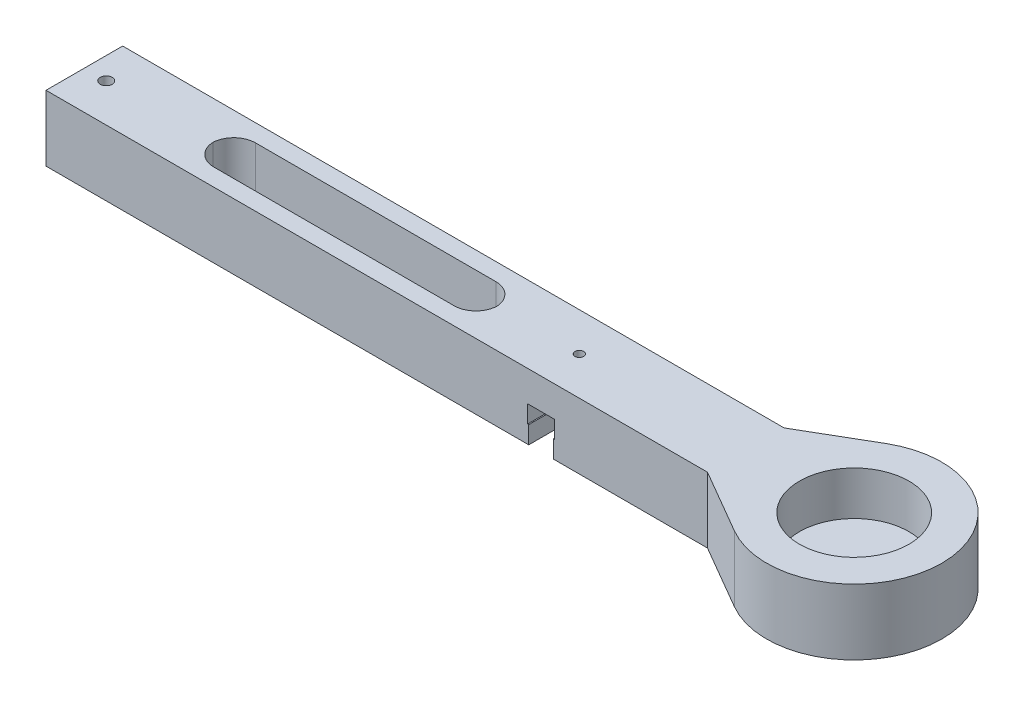
ISO-10303-21;
HEADER;
FILE_DESCRIPTION(('STEP AP214'),'2;1');
FILE_NAME('part.step','',(''),(''),'','','');
FILE_SCHEMA(('AUTOMOTIVE_DESIGN { 1 0 10303 214 1 1 1 1 }'));
ENDSEC;
DATA;
#1=APPLICATION_CONTEXT('core data for automotive mechanical design processes');
#2=APPLICATION_PROTOCOL_DEFINITION('international standard','automotive_design',2000,#1);
#3=PRODUCT_CONTEXT('',#1,'mechanical');
#4=PRODUCT('Part','Part','',(#3));
#5=PRODUCT_RELATED_PRODUCT_CATEGORY('part','',(#4));
#6=PRODUCT_DEFINITION_FORMATION('','',#4);
#7=PRODUCT_DEFINITION_CONTEXT('part definition',#1,'design');
#8=PRODUCT_DEFINITION('design','',#6,#7);
#9=PRODUCT_DEFINITION_SHAPE('','',#8);
#10=(LENGTH_UNIT() NAMED_UNIT(*) SI_UNIT(.MILLI.,.METRE.));
#11=(NAMED_UNIT(*) PLANE_ANGLE_UNIT() SI_UNIT($,.RADIAN.));
#12=(NAMED_UNIT(*) SI_UNIT($,.STERADIAN.) SOLID_ANGLE_UNIT());
#13=UNCERTAINTY_MEASURE_WITH_UNIT(LENGTH_MEASURE(1.E-05),#10,'distance_accuracy_value','');
#14=(GEOMETRIC_REPRESENTATION_CONTEXT(3) GLOBAL_UNCERTAINTY_ASSIGNED_CONTEXT((#13)) GLOBAL_UNIT_ASSIGNED_CONTEXT((#10,
#11,#12)) REPRESENTATION_CONTEXT('',''));
#15=CARTESIAN_POINT('',(0.,0.,0.));
#16=DIRECTION('',(0.,0.,1.));
#17=DIRECTION('',(1.,0.,0.));
#18=AXIS2_PLACEMENT_3D('',#15,#16,#17);
#19=CARTESIAN_POINT('',(-21.,30.,0.));
#20=DIRECTION('',(0.,-1.,0.));
#21=DIRECTION('',(0.,0.,-1.));
#22=AXIS2_PLACEMENT_3D('',#19,#20,#21);
#23=CYLINDRICAL_SURFACE('',#22,5.6);
#24=DIRECTION('',(0.,-1.,0.));
#25=VECTOR('',#24,1.);
#26=CARTESIAN_POINT('',(-26.6,8.,0.));
#27=LINE('',#26,#25);
#28=CARTESIAN_POINT('',(-26.6,8.,0.));
#29=VERTEX_POINT('',#28);
#30=CARTESIAN_POINT('',(-26.6,0.,0.));
#31=VERTEX_POINT('',#30);
#32=EDGE_CURVE('E337',#29,#31,#27,.T.);
#33=ORIENTED_EDGE('',*,*,#32,.T.);
#34=CARTESIAN_POINT('',(-21.,0.,0.));
#35=DIRECTION('',(0.,-1.,0.));
#36=DIRECTION('',(0.,0.,-1.));
#37=AXIS2_PLACEMENT_3D('',#34,#35,#36);
#38=CIRCLE('',#37,5.6);
#39=CARTESIAN_POINT('',(-15.4,0.,0.));
#40=VERTEX_POINT('',#39);
#41=EDGE_CURVE('E397',#31,#40,#38,.T.);
#42=ORIENTED_EDGE('',*,*,#41,.T.);
#43=DIRECTION('',(0.,1.,0.));
#44=VECTOR('',#43,1.);
#45=CARTESIAN_POINT('',(-15.4,0.,0.));
#46=LINE('',#45,#44);
#47=CARTESIAN_POINT('',(-15.4,8.,0.));
#48=VERTEX_POINT('',#47);
#49=EDGE_CURVE('E340',#40,#48,#46,.T.);
#50=ORIENTED_EDGE('',*,*,#49,.T.);
#51=CARTESIAN_POINT('',(-21.,8.,0.));
#52=DIRECTION('',(0.,1.,0.));
#53=DIRECTION('',(0.,0.,1.));
#54=AXIS2_PLACEMENT_3D('',#51,#52,#53);
#55=CIRCLE('',#54,5.6);
#56=EDGE_CURVE('E391',#29,#48,#55,.F.);
#57=ORIENTED_EDGE('',*,*,#56,.F.);
#58=EDGE_LOOP('',(#33,#42,#50,#57));
#59=FACE_BOUND('',#58,.T.);
#60=ADVANCED_FACE('F37',(#59),#23,.F.);
#61=CARTESIAN_POINT('',(-247.,30.,17.5));
#62=DIRECTION('',(-1.,0.,0.));
#63=DIRECTION('',(0.,0.,1.));
#64=AXIS2_PLACEMENT_3D('',#61,#62,#63);
#65=PLANE('',#64);
#66=DIRECTION('',(0.,0.,-1.));
#67=VECTOR('',#66,1.);
#68=CARTESIAN_POINT('',(-247.,0.,17.5));
#69=LINE('',#68,#67);
#70=CARTESIAN_POINT('',(-247.,0.,17.5));
#71=VERTEX_POINT('',#70);
#72=CARTESIAN_POINT('',(-247.,0.,-17.5));
#73=VERTEX_POINT('',#72);
#74=EDGE_CURVE('E400',#71,#73,#69,.T.);
#75=ORIENTED_EDGE('',*,*,#74,.F.);
#76=DIRECTION('',(0.,-1.,0.));
#77=VECTOR('',#76,1.);
#78=CARTESIAN_POINT('',(-247.,30.,17.5));
#79=LINE('',#78,#77);
#80=CARTESIAN_POINT('',(-247.,30.,17.5));
#81=VERTEX_POINT('',#80);
#82=EDGE_CURVE('E413',#81,#71,#79,.T.);
#83=ORIENTED_EDGE('',*,*,#82,.F.);
#84=DIRECTION('',(0.,0.,-1.));
#85=VECTOR('',#84,1.);
#86=CARTESIAN_POINT('',(-247.,30.,17.5));
#87=LINE('',#86,#85);
#88=CARTESIAN_POINT('',(-247.,30.,-17.5));
#89=VERTEX_POINT('',#88);
#90=EDGE_CURVE('E401',#81,#89,#87,.T.);
#91=ORIENTED_EDGE('',*,*,#90,.T.);
#92=DIRECTION('',(0.,-1.,0.));
#93=VECTOR('',#92,1.);
#94=CARTESIAN_POINT('',(-247.,30.,-17.5));
#95=LINE('',#94,#93);
#96=EDGE_CURVE('E408',#89,#73,#95,.T.);
#97=ORIENTED_EDGE('',*,*,#96,.T.);
#98=EDGE_LOOP('',(#75,#83,#91,#97));
#99=FACE_BOUND('',#98,.T.);
#100=ADVANCED_FACE('F488',(#99),#65,.T.);
#101=CARTESIAN_POINT('',(-247.,30.,17.5));
#102=DIRECTION('',(0.,0.,-1.));
#103=DIRECTION('',(-1.,0.,0.));
#104=AXIS2_PLACEMENT_3D('',#101,#102,#103);
#105=PLANE('',#104);
#106=DIRECTION('',(1.,0.,0.));
#107=VECTOR('',#106,1.);
#108=CARTESIAN_POINT('',(-15.4,8.,17.5));
#109=LINE('',#108,#107);
#110=CARTESIAN_POINT('',(-15.4,8.,17.5));
#111=VERTEX_POINT('',#110);
#112=CARTESIAN_POINT('',(-14.9,8.,17.5));
#113=VERTEX_POINT('',#112);
#114=EDGE_CURVE('E354',#111,#113,#109,.T.);
#115=ORIENTED_EDGE('',*,*,#114,.F.);
#116=DIRECTION('',(0.,1.,0.));
#117=VECTOR('',#116,1.);
#118=CARTESIAN_POINT('',(-15.4,0.,17.5));
#119=LINE('',#118,#117);
#120=CARTESIAN_POINT('',(-15.4,0.,17.5));
#121=VERTEX_POINT('',#120);
#122=EDGE_CURVE('E226',#121,#111,#119,.T.);
#123=ORIENTED_EDGE('',*,*,#122,.F.);
#124=DIRECTION('',(1.,0.,0.));
#125=VECTOR('',#124,1.);
#126=CARTESIAN_POINT('',(-247.,0.,17.5));
#127=LINE('',#126,#125);
#128=CARTESIAN_POINT('',(55.,0.,17.4999999999999));
#129=VERTEX_POINT('',#128);
#130=EDGE_CURVE('E218',#121,#129,#127,.T.);
#131=ORIENTED_EDGE('',*,*,#130,.T.);
#132=DIRECTION('',(0.,-1.,0.));
#133=VECTOR('',#132,1.);
#134=CARTESIAN_POINT('',(55.,30.,17.4999999999999));
#135=LINE('',#134,#133);
#136=CARTESIAN_POINT('',(55.,30.,17.4999999999999));
#137=VERTEX_POINT('',#136);
#138=EDGE_CURVE('E223',#137,#129,#135,.T.);
#139=ORIENTED_EDGE('',*,*,#138,.F.);
#140=DIRECTION('',(1.,0.,0.));
#141=VECTOR('',#140,1.);
#142=CARTESIAN_POINT('',(-247.,30.,17.5));
#143=LINE('',#142,#141);
#144=EDGE_CURVE('E406',#81,#137,#143,.T.);
#145=ORIENTED_EDGE('',*,*,#144,.F.);
#146=ORIENTED_EDGE('',*,*,#82,.T.);
#147=CARTESIAN_POINT('',(-26.6,0.,17.5));
#148=VERTEX_POINT('',#147);
#149=EDGE_CURVE('E230',#71,#148,#127,.T.);
#150=ORIENTED_EDGE('',*,*,#149,.T.);
#151=DIRECTION('',(0.,-1.,0.));
#152=VECTOR('',#151,1.);
#153=CARTESIAN_POINT('',(-26.6,8.,17.5));
#154=LINE('',#153,#152);
#155=CARTESIAN_POINT('',(-26.6,8.,17.5));
#156=VERTEX_POINT('',#155);
#157=EDGE_CURVE('E351',#156,#148,#154,.T.);
#158=ORIENTED_EDGE('',*,*,#157,.F.);
#159=DIRECTION('',(1.,0.,0.));
#160=VECTOR('',#159,1.);
#161=CARTESIAN_POINT('',(-27.1,8.,17.5));
#162=LINE('',#161,#160);
#163=CARTESIAN_POINT('',(-27.1,8.,17.5));
#164=VERTEX_POINT('',#163);
#165=EDGE_CURVE('E348',#164,#156,#162,.T.);
#166=ORIENTED_EDGE('',*,*,#165,.F.);
#167=DIRECTION('',(0.,-1.,0.));
#168=VECTOR('',#167,1.);
#169=CARTESIAN_POINT('',(-27.1,8.,17.5));
#170=LINE('',#169,#168);
#171=CARTESIAN_POINT('',(-27.1,16.,17.5));
#172=VERTEX_POINT('',#171);
#173=EDGE_CURVE('E345',#172,#164,#170,.T.);
#174=ORIENTED_EDGE('',*,*,#173,.F.);
#175=DIRECTION('',(-1.,0.,0.));
#176=VECTOR('',#175,1.);
#177=CARTESIAN_POINT('',(-21.,16.,17.5));
#178=LINE('',#177,#176);
#179=CARTESIAN_POINT('',(-14.9,16.,17.5));
#180=VERTEX_POINT('',#179);
#181=EDGE_CURVE('E341',#180,#172,#178,.T.);
#182=ORIENTED_EDGE('',*,*,#181,.F.);
#183=DIRECTION('',(0.,1.,0.));
#184=VECTOR('',#183,1.);
#185=CARTESIAN_POINT('',(-14.9,8.,17.5));
#186=LINE('',#185,#184);
#187=EDGE_CURVE('E357',#113,#180,#186,.T.);
#188=ORIENTED_EDGE('',*,*,#187,.F.);
#189=EDGE_LOOP('',(#115,#123,#131,#139,#145,#146,#150,#158,#166,#174,#182,#188));
#190=FACE_BOUND('',#189,.T.);
#191=ADVANCED_FACE('F221',(#190),#105,.F.);
#192=CARTESIAN_POINT('',(-247.,30.,-17.5));
#193=DIRECTION('',(0.,0.,-1.));
#194=DIRECTION('',(-1.,0.,0.));
#195=AXIS2_PLACEMENT_3D('',#192,#193,#194);
#196=PLANE('',#195);
#197=DIRECTION('',(1.,0.,0.));
#198=VECTOR('',#197,1.);
#199=CARTESIAN_POINT('',(-247.,0.,-17.5));
#200=LINE('',#199,#198);
#201=CARTESIAN_POINT('',(55.,0.,-17.5000000000001));
#202=VERTEX_POINT('',#201);
#203=EDGE_CURVE('E231',#73,#202,#200,.T.);
#204=ORIENTED_EDGE('',*,*,#203,.F.);
#205=ORIENTED_EDGE('',*,*,#96,.F.);
#206=DIRECTION('',(1.,0.,0.));
#207=VECTOR('',#206,1.);
#208=CARTESIAN_POINT('',(-247.,30.,-17.5));
#209=LINE('',#208,#207);
#210=CARTESIAN_POINT('',(55.,30.,-17.5000000000001));
#211=VERTEX_POINT('',#210);
#212=EDGE_CURVE('E404',#89,#211,#209,.T.);
#213=ORIENTED_EDGE('',*,*,#212,.T.);
#214=DIRECTION('',(0.,1.,0.));
#215=VECTOR('',#214,1.);
#216=CARTESIAN_POINT('',(55.,0.,-17.5000000000001));
#217=LINE('',#216,#215);
#218=EDGE_CURVE('E240',#202,#211,#217,.T.);
#219=ORIENTED_EDGE('',*,*,#218,.F.);
#220=EDGE_LOOP('',(#204,#205,#213,#219));
#221=FACE_BOUND('',#220,.T.);
#222=ADVANCED_FACE('F473',(#221),#196,.T.);
#223=CARTESIAN_POINT('',(0.,30.,0.));
#224=DIRECTION('',(0.,-1.,0.));
#225=DIRECTION('',(0.,0.,-1.));
#226=AXIS2_PLACEMENT_3D('',#223,#224,#225);
#227=PLANE('',#226);
#228=CARTESIAN_POINT('',(104.501054052442,30.,0.));
#229=DIRECTION('',(0.,1.,0.));
#230=DIRECTION('',(0.,0.,1.));
#231=AXIS2_PLACEMENT_3D('',#228,#229,#230);
#232=CIRCLE('',#231,25.);
#233=CARTESIAN_POINT('',(104.501054052442,30.,25.));
#234=VERTEX_POINT('',#233);
#235=EDGE_CURVE('E829',#234,#234,#232,.T.);
#236=ORIENTED_EDGE('',*,*,#235,.F.);
#237=EDGE_LOOP('',(#236));
#238=FACE_BOUND('',#237,.T.);
#239=DIRECTION('',(1.,0.,0.));
#240=VECTOR('',#239,1.);
#241=CARTESIAN_POINT('',(-58.6672836549939,30.,9.53844020310874));
#242=LINE('',#241,#240);
#243=CARTESIAN_POINT('',(-178.332716345006,30.,9.53844020310875));
#244=VERTEX_POINT('',#243);
#245=CARTESIAN_POINT('',(-68.6672836549939,30.,9.53844020310874));
#246=VERTEX_POINT('',#245);
#247=EDGE_CURVE('E274',#244,#246,#242,.T.);
#248=ORIENTED_EDGE('',*,*,#247,.F.);
#249=CARTESIAN_POINT('',(-178.332716345006,30.,-0.461559796891247));
#250=DIRECTION('',(0.,-1.,0.));
#251=DIRECTION('',(0.,0.,-1.));
#252=AXIS2_PLACEMENT_3D('',#249,#250,#251);
#253=CIRCLE('',#252,10.);
#254=CARTESIAN_POINT('',(-188.322058793531,30.,0.));
#255=VERTEX_POINT('',#254);
#256=EDGE_CURVE('E46',#244,#255,#253,.T.);
#257=ORIENTED_EDGE('',*,*,#256,.T.);
#258=CARTESIAN_POINT('',(-178.332716345006,30.,0.461559796891295));
#259=DIRECTION('',(0.,-1.,0.));
#260=DIRECTION('',(0.,0.,-1.));
#261=AXIS2_PLACEMENT_3D('',#258,#259,#260);
#262=CIRCLE('',#261,10.);
#263=CARTESIAN_POINT('',(-178.332716345006,30.,-9.53844020310871));
#264=VERTEX_POINT('',#263);
#265=EDGE_CURVE('E441',#255,#264,#262,.T.);
#266=ORIENTED_EDGE('',*,*,#265,.T.);
#267=DIRECTION('',(-1.,0.,0.));
#268=VECTOR('',#267,1.);
#269=CARTESIAN_POINT('',(-58.6672836549939,30.,-9.53844020310872));
#270=LINE('',#269,#268);
#271=CARTESIAN_POINT('',(-68.6672836549939,30.,-9.53844020310872));
#272=VERTEX_POINT('',#271);
#273=EDGE_CURVE('E271',#272,#264,#270,.T.);
#274=ORIENTED_EDGE('',*,*,#273,.F.);
#275=CARTESIAN_POINT('',(-68.6672836549939,30.,0.46155979689128));
#276=DIRECTION('',(0.,-1.,0.));
#277=DIRECTION('',(0.,0.,-1.));
#278=AXIS2_PLACEMENT_3D('',#275,#276,#277);
#279=CIRCLE('',#278,10.);
#280=CARTESIAN_POINT('',(-58.6779412064694,30.,0.));
#281=VERTEX_POINT('',#280);
#282=EDGE_CURVE('E437',#272,#281,#279,.T.);
#283=ORIENTED_EDGE('',*,*,#282,.T.);
#284=CARTESIAN_POINT('',(-68.6672836549939,30.,-0.46155979689126));
#285=DIRECTION('',(0.,-1.,0.));
#286=DIRECTION('',(0.,0.,-1.));
#287=AXIS2_PLACEMENT_3D('',#284,#285,#286);
#288=CIRCLE('',#287,10.);
#289=EDGE_CURVE('E433',#281,#246,#288,.T.);
#290=ORIENTED_EDGE('',*,*,#289,.T.);
#291=EDGE_LOOP('',(#248,#257,#266,#274,#283,#290));
#292=FACE_BOUND('',#291,.T.);
#293=CARTESIAN_POINT('',(-237.,30.,0.));
#294=DIRECTION('',(0.,1.,0.));
#295=DIRECTION('',(0.,0.,1.));
#296=AXIS2_PLACEMENT_3D('',#293,#294,#295);
#297=CIRCLE('',#296,2.75000000000001);
#298=CARTESIAN_POINT('',(-237.,30.,2.75000000000001));
#299=VERTEX_POINT('',#298);
#300=EDGE_CURVE('E330',#299,#299,#297,.T.);
#301=ORIENTED_EDGE('',*,*,#300,.F.);
#302=EDGE_LOOP('',(#301));
#303=FACE_BOUND('',#302,.T.);
#304=CARTESIAN_POINT('',(-21.,30.,0.));
#305=DIRECTION('',(0.,1.,0.));
#306=DIRECTION('',(0.,0.,1.));
#307=AXIS2_PLACEMENT_3D('',#304,#305,#306);
#308=CIRCLE('',#307,2.);
#309=CARTESIAN_POINT('',(-21.,30.,2.));
#310=VERTEX_POINT('',#309);
#311=EDGE_CURVE('E333',#310,#310,#308,.T.);
#312=ORIENTED_EDGE('',*,*,#311,.F.);
#313=EDGE_LOOP('',(#312));
#314=FACE_BOUND('',#313,.T.);
#315=ORIENTED_EDGE('',*,*,#144,.T.);
#316=DIRECTION('',(0.864641935503422,0.,0.50238861787355));
#317=VECTOR('',#316,1.);
#318=CARTESIAN_POINT('',(55.,30.,17.4999999999999));
#319=LINE('',#318,#317);
#320=CARTESIAN_POINT('',(84.4055093374998,30.,34.5856774201368));
#321=VERTEX_POINT('',#320);
#322=EDGE_CURVE('E239',#137,#321,#319,.T.);
#323=ORIENTED_EDGE('',*,*,#322,.T.);
#324=CARTESIAN_POINT('',(104.501054052442,30.,0.));
#325=DIRECTION('',(0.,1.,0.));
#326=DIRECTION('',(0.,0.,1.));
#327=AXIS2_PLACEMENT_3D('',#324,#325,#326);
#328=CIRCLE('',#327,40.);
#329=CARTESIAN_POINT('',(84.4055093374998,30.,-34.5856774201369));
#330=VERTEX_POINT('',#329);
#331=EDGE_CURVE('E251',#321,#330,#328,.T.);
#332=ORIENTED_EDGE('',*,*,#331,.T.);
#333=DIRECTION('',(-0.864641935503423,0.,0.502388617873549));
#334=VECTOR('',#333,1.);
#335=CARTESIAN_POINT('',(84.4055093374998,30.,-34.5856774201369));
#336=LINE('',#335,#334);
#337=EDGE_CURVE('E255',#330,#211,#336,.T.);
#338=ORIENTED_EDGE('',*,*,#337,.T.);
#339=ORIENTED_EDGE('',*,*,#212,.F.);
#340=ORIENTED_EDGE('',*,*,#90,.F.);
#341=EDGE_LOOP('',(#315,#323,#332,#338,#339,#340));
#342=FACE_BOUND('',#341,.T.);
#343=ADVANCED_FACE('F470',(#238,#292,#303,#314,#342),#227,.F.);
#344=CARTESIAN_POINT('',(0.,0.,0.));
#345=DIRECTION('',(0.,-1.,0.));
#346=DIRECTION('',(0.,0.,-1.));
#347=AXIS2_PLACEMENT_3D('',#344,#345,#346);
#348=PLANE('',#347);
#349=CARTESIAN_POINT('',(-178.332716345006,0.,0.461559796891295));
#350=DIRECTION('',(0.,-1.,0.));
#351=DIRECTION('',(0.,0.,-1.));
#352=AXIS2_PLACEMENT_3D('',#349,#350,#351);
#353=CIRCLE('',#352,10.);
#354=CARTESIAN_POINT('',(-178.332716345006,0.,-9.53844020310871));
#355=VERTEX_POINT('',#354);
#356=CARTESIAN_POINT('',(-188.322058793531,0.,0.));
#357=VERTEX_POINT('',#356);
#358=EDGE_CURVE('E53',#355,#357,#353,.F.);
#359=ORIENTED_EDGE('',*,*,#358,.T.);
#360=CARTESIAN_POINT('',(-178.332716345006,0.,-0.461559796891247));
#361=DIRECTION('',(0.,-1.,0.));
#362=DIRECTION('',(0.,0.,-1.));
#363=AXIS2_PLACEMENT_3D('',#360,#361,#362);
#364=CIRCLE('',#363,10.);
#365=CARTESIAN_POINT('',(-178.332716345006,0.,9.53844020310875));
#366=VERTEX_POINT('',#365);
#367=EDGE_CURVE('E11',#357,#366,#364,.F.);
#368=ORIENTED_EDGE('',*,*,#367,.T.);
#369=DIRECTION('',(1.,0.,0.));
#370=VECTOR('',#369,1.);
#371=CARTESIAN_POINT('',(-58.6672836549939,0.,9.53844020310874));
#372=LINE('',#371,#370);
#373=CARTESIAN_POINT('',(-68.6672836549939,0.,9.53844020310874));
#374=VERTEX_POINT('',#373);
#375=EDGE_CURVE('E267',#366,#374,#372,.T.);
#376=ORIENTED_EDGE('',*,*,#375,.T.);
#377=CARTESIAN_POINT('',(-68.6672836549939,0.,-0.46155979689126));
#378=DIRECTION('',(0.,-1.,0.));
#379=DIRECTION('',(0.,0.,-1.));
#380=AXIS2_PLACEMENT_3D('',#377,#378,#379);
#381=CIRCLE('',#380,10.);
#382=CARTESIAN_POINT('',(-58.6779412064694,0.,0.));
#383=VERTEX_POINT('',#382);
#384=EDGE_CURVE('E435',#374,#383,#381,.F.);
#385=ORIENTED_EDGE('',*,*,#384,.T.);
#386=CARTESIAN_POINT('',(-68.6672836549939,0.,0.46155979689128));
#387=DIRECTION('',(0.,-1.,0.));
#388=DIRECTION('',(0.,0.,-1.));
#389=AXIS2_PLACEMENT_3D('',#386,#387,#388);
#390=CIRCLE('',#389,10.);
#391=CARTESIAN_POINT('',(-68.6672836549939,0.,-9.53844020310872));
#392=VERTEX_POINT('',#391);
#393=EDGE_CURVE('E439',#383,#392,#390,.F.);
#394=ORIENTED_EDGE('',*,*,#393,.T.);
#395=DIRECTION('',(-1.,0.,0.));
#396=VECTOR('',#395,1.);
#397=CARTESIAN_POINT('',(-58.6672836549939,0.,-9.53844020310872));
#398=LINE('',#397,#396);
#399=EDGE_CURVE('E270',#392,#355,#398,.T.);
#400=ORIENTED_EDGE('',*,*,#399,.T.);
#401=EDGE_LOOP('',(#359,#368,#376,#385,#394,#400));
#402=FACE_BOUND('',#401,.T.);
#403=DIRECTION('',(-0.0469135489679844,0.,-0.998898953309707));
#404=VECTOR('',#403,1.);
#405=CARTESIAN_POINT('',(-241.130206963534,0.,2.650419546357));
#406=LINE('',#405,#404);
#407=CARTESIAN_POINT('',(-241.130206963534,0.,2.650419546357));
#408=VERTEX_POINT('',#407);
#409=CARTESIAN_POINT('',(-241.360434139599,0.,-2.25165438012909));
#410=VERTEX_POINT('',#409);
#411=EDGE_CURVE('E292',#408,#410,#406,.T.);
#412=ORIENTED_EDGE('',*,*,#411,.F.);
#413=DIRECTION('',(-0.888528643863882,0.,-0.458821151466898));
#414=VECTOR('',#413,1.);
#415=CARTESIAN_POINT('',(-236.769772823935,0.,4.90207392648608));
#416=LINE('',#415,#414);
#417=CARTESIAN_POINT('',(-236.769772823935,0.,4.90207392648608));
#418=VERTEX_POINT('',#417);
#419=EDGE_CURVE('E273',#418,#408,#416,.T.);
#420=ORIENTED_EDGE('',*,*,#419,.F.);
#421=DIRECTION('',(-0.841615094895903,0.,0.540077801842809));
#422=VECTOR('',#421,1.);
#423=CARTESIAN_POINT('',(-232.639565860401,0.,2.25165438012911));
#424=LINE('',#423,#422);
#425=CARTESIAN_POINT('',(-232.639565860401,0.,2.25165438012911));
#426=VERTEX_POINT('',#425);
#427=EDGE_CURVE('E280',#426,#418,#424,.T.);
#428=ORIENTED_EDGE('',*,*,#427,.F.);
#429=DIRECTION('',(0.0469135489679849,0.,0.998898953309707));
#430=VECTOR('',#429,1.);
#431=CARTESIAN_POINT('',(-232.869793036466,0.,-2.65041954635692));
#432=LINE('',#431,#430);
#433=CARTESIAN_POINT('',(-232.869793036466,0.,-2.65041954635692));
#434=VERTEX_POINT('',#433);
#435=EDGE_CURVE('E283',#434,#426,#432,.T.);
#436=ORIENTED_EDGE('',*,*,#435,.F.);
#437=DIRECTION('',(0.888528643863882,0.,0.458821151466898));
#438=VECTOR('',#437,1.);
#439=CARTESIAN_POINT('',(-237.230227176065,0.,-4.90207392648602));
#440=LINE('',#439,#438);
#441=CARTESIAN_POINT('',(-237.230227176065,0.,-4.90207392648602));
#442=VERTEX_POINT('',#441);
#443=EDGE_CURVE('E286',#442,#434,#440,.T.);
#444=ORIENTED_EDGE('',*,*,#443,.F.);
#445=DIRECTION('',(0.841615094895902,0.,-0.54007780184281));
#446=VECTOR('',#445,1.);
#447=CARTESIAN_POINT('',(-241.360434139599,0.,-2.25165438012909));
#448=LINE('',#447,#446);
#449=EDGE_CURVE('E289',#410,#442,#448,.T.);
#450=ORIENTED_EDGE('',*,*,#449,.F.);
#451=EDGE_LOOP('',(#412,#420,#428,#436,#444,#450));
#452=FACE_BOUND('',#451,.T.);
#453=DIRECTION('',(0.,0.,1.));
#454=VECTOR('',#453,1.);
#455=CARTESIAN_POINT('',(-15.4,0.,0.));
#456=LINE('',#455,#454);
#457=EDGE_CURVE('E365',#40,#121,#456,.T.);
#458=ORIENTED_EDGE('',*,*,#457,.F.);
#459=ORIENTED_EDGE('',*,*,#41,.F.);
#460=DIRECTION('',(0.,0.,1.));
#461=VECTOR('',#460,1.);
#462=CARTESIAN_POINT('',(-26.6,0.,0.));
#463=LINE('',#462,#461);
#464=EDGE_CURVE('E367',#31,#148,#463,.T.);
#465=ORIENTED_EDGE('',*,*,#464,.T.);
#466=ORIENTED_EDGE('',*,*,#149,.F.);
#467=ORIENTED_EDGE('',*,*,#74,.T.);
#468=ORIENTED_EDGE('',*,*,#203,.T.);
#469=DIRECTION('',(-0.864641935503423,0.,0.502388617873549));
#470=VECTOR('',#469,1.);
#471=CARTESIAN_POINT('',(84.4055093374998,0.,-34.5856774201369));
#472=LINE('',#471,#470);
#473=CARTESIAN_POINT('',(84.4055093374998,0.,-34.5856774201369));
#474=VERTEX_POINT('',#473);
#475=EDGE_CURVE('E246',#474,#202,#472,.T.);
#476=ORIENTED_EDGE('',*,*,#475,.F.);
#477=CARTESIAN_POINT('',(104.501054052442,0.,0.));
#478=DIRECTION('',(0.,1.,0.));
#479=DIRECTION('',(0.,0.,1.));
#480=AXIS2_PLACEMENT_3D('',#477,#478,#479);
#481=CIRCLE('',#480,40.);
#482=CARTESIAN_POINT('',(84.4055093374998,0.,34.5856774201368));
#483=VERTEX_POINT('',#482);
#484=EDGE_CURVE('E245',#483,#474,#481,.T.);
#485=ORIENTED_EDGE('',*,*,#484,.F.);
#486=DIRECTION('',(0.864641935503422,0.,0.50238861787355));
#487=VECTOR('',#486,1.);
#488=CARTESIAN_POINT('',(55.,0.,17.4999999999999));
#489=LINE('',#488,#487);
#490=EDGE_CURVE('E236',#129,#483,#489,.T.);
#491=ORIENTED_EDGE('',*,*,#490,.F.);
#492=ORIENTED_EDGE('',*,*,#130,.F.);
#493=EDGE_LOOP('',(#458,#459,#465,#466,#467,#468,#476,#485,#491,#492));
#494=FACE_BOUND('',#493,.T.);
#495=ADVANCED_FACE('F242',(#402,#452,#494),#348,.T.);
#496=CARTESIAN_POINT('',(0.,8.,0.));
#497=DIRECTION('',(0.,1.,0.));
#498=DIRECTION('',(0.,0.,1.));
#499=AXIS2_PLACEMENT_3D('',#496,#497,#498);
#500=PLANE('',#499);
#501=DIRECTION('',(0.,0.,1.));
#502=VECTOR('',#501,1.);
#503=CARTESIAN_POINT('',(-15.4,8.,0.));
#504=LINE('',#503,#502);
#505=EDGE_CURVE('E362',#48,#111,#504,.T.);
#506=ORIENTED_EDGE('',*,*,#505,.T.);
#507=ORIENTED_EDGE('',*,*,#114,.T.);
#508=DIRECTION('',(0.,0.,-1.));
#509=VECTOR('',#508,1.);
#510=CARTESIAN_POINT('',(-14.9,8.,3.52183664205672));
#511=LINE('',#510,#509);
#512=CARTESIAN_POINT('',(-14.9,8.,-3.52183664205671));
#513=VERTEX_POINT('',#512);
#514=EDGE_CURVE('E377',#113,#513,#511,.T.);
#515=ORIENTED_EDGE('',*,*,#514,.T.);
#516=DIRECTION('',(-0.866025403784439,0.,-0.5));
#517=VECTOR('',#516,1.);
#518=CARTESIAN_POINT('',(-14.9,8.,-3.52183664205671));
#519=LINE('',#518,#517);
#520=CARTESIAN_POINT('',(-21.,8.,-7.04367328411343));
#521=VERTEX_POINT('',#520);
#522=EDGE_CURVE('E379',#513,#521,#519,.T.);
#523=ORIENTED_EDGE('',*,*,#522,.T.);
#524=DIRECTION('',(-0.866025403784439,0.,0.5));
#525=VECTOR('',#524,1.);
#526=CARTESIAN_POINT('',(-21.,8.,-7.04367328411343));
#527=LINE('',#526,#525);
#528=CARTESIAN_POINT('',(-27.1,8.,-3.52183664205672));
#529=VERTEX_POINT('',#528);
#530=EDGE_CURVE('E382',#521,#529,#527,.T.);
#531=ORIENTED_EDGE('',*,*,#530,.T.);
#532=DIRECTION('',(0.,0.,1.));
#533=VECTOR('',#532,1.);
#534=CARTESIAN_POINT('',(-27.1,8.,-3.52183664205672));
#535=LINE('',#534,#533);
#536=EDGE_CURVE('E385',#529,#164,#535,.T.);
#537=ORIENTED_EDGE('',*,*,#536,.T.);
#538=ORIENTED_EDGE('',*,*,#165,.T.);
#539=DIRECTION('',(0.,0.,1.));
#540=VECTOR('',#539,1.);
#541=CARTESIAN_POINT('',(-26.6,8.,0.));
#542=LINE('',#541,#540);
#543=EDGE_CURVE('E344',#29,#156,#542,.T.);
#544=ORIENTED_EDGE('',*,*,#543,.F.);
#545=ORIENTED_EDGE('',*,*,#56,.T.);
#546=EDGE_LOOP('',(#506,#507,#515,#523,#531,#537,#538,#544,#545));
#547=FACE_BOUND('',#546,.T.);
#548=ADVANCED_FACE('F519',(#547),#500,.T.);
#549=CARTESIAN_POINT('',(-14.9,8.,3.52183664205672));
#550=DIRECTION('',(1.,0.,0.));
#551=DIRECTION('',(0.,0.,-1.));
#552=AXIS2_PLACEMENT_3D('',#549,#550,#551);
#553=PLANE('',#552);
#554=DIRECTION('',(0.,0.,-1.));
#555=VECTOR('',#554,1.);
#556=CARTESIAN_POINT('',(-14.9,16.,3.52183664205672));
#557=LINE('',#556,#555);
#558=CARTESIAN_POINT('',(-14.9,16.,-3.52183664205671));
#559=VERTEX_POINT('',#558);
#560=EDGE_CURVE('E375',#180,#559,#557,.T.);
#561=ORIENTED_EDGE('',*,*,#560,.T.);
#562=DIRECTION('',(0.,1.,0.));
#563=VECTOR('',#562,1.);
#564=CARTESIAN_POINT('',(-14.9,8.,-3.52183664205671));
#565=LINE('',#564,#563);
#566=EDGE_CURVE('E387',#513,#559,#565,.T.);
#567=ORIENTED_EDGE('',*,*,#566,.F.);
#568=ORIENTED_EDGE('',*,*,#514,.F.);
#569=ORIENTED_EDGE('',*,*,#187,.T.);
#570=EDGE_LOOP('',(#561,#567,#568,#569));
#571=FACE_BOUND('',#570,.T.);
#572=ADVANCED_FACE('F514',(#571),#553,.F.);
#573=CARTESIAN_POINT('',(-27.1,8.,-3.52183664205672));
#574=DIRECTION('',(-1.,0.,0.));
#575=DIRECTION('',(0.,0.,1.));
#576=AXIS2_PLACEMENT_3D('',#573,#574,#575);
#577=PLANE('',#576);
#578=ORIENTED_EDGE('',*,*,#173,.T.);
#579=ORIENTED_EDGE('',*,*,#536,.F.);
#580=DIRECTION('',(0.,1.,0.));
#581=VECTOR('',#580,1.);
#582=CARTESIAN_POINT('',(-27.1,8.,-3.52183664205672));
#583=LINE('',#582,#581);
#584=CARTESIAN_POINT('',(-27.1,16.,-3.52183664205672));
#585=VERTEX_POINT('',#584);
#586=EDGE_CURVE('E388',#529,#585,#583,.T.);
#587=ORIENTED_EDGE('',*,*,#586,.T.);
#588=DIRECTION('',(0.,0.,1.));
#589=VECTOR('',#588,1.);
#590=CARTESIAN_POINT('',(-27.1,16.,-3.52183664205672));
#591=LINE('',#590,#589);
#592=EDGE_CURVE('E373',#585,#172,#591,.T.);
#593=ORIENTED_EDGE('',*,*,#592,.T.);
#594=EDGE_LOOP('',(#578,#579,#587,#593));
#595=FACE_BOUND('',#594,.T.);
#596=ADVANCED_FACE('F587',(#595),#577,.F.);
#597=CARTESIAN_POINT('',(-21.,8.,-7.04367328411343));
#598=DIRECTION('',(-0.5,0.,-0.866025403784439));
#599=DIRECTION('',(-0.866025403784439,0.,0.5));
#600=AXIS2_PLACEMENT_3D('',#597,#598,#599);
#601=PLANE('',#600);
#602=DIRECTION('',(0.,1.,0.));
#603=VECTOR('',#602,1.);
#604=CARTESIAN_POINT('',(-21.,8.,-7.04367328411343));
#605=LINE('',#604,#603);
#606=CARTESIAN_POINT('',(-21.,16.,-7.04367328411343));
#607=VERTEX_POINT('',#606);
#608=EDGE_CURVE('E392',#521,#607,#605,.T.);
#609=ORIENTED_EDGE('',*,*,#608,.T.);
#610=DIRECTION('',(-0.866025403784439,0.,0.5));
#611=VECTOR('',#610,1.);
#612=CARTESIAN_POINT('',(-21.,16.,-7.04367328411343));
#613=LINE('',#612,#611);
#614=EDGE_CURVE('E364',#607,#585,#613,.T.);
#615=ORIENTED_EDGE('',*,*,#614,.T.);
#616=ORIENTED_EDGE('',*,*,#586,.F.);
#617=ORIENTED_EDGE('',*,*,#530,.F.);
#618=EDGE_LOOP('',(#609,#615,#616,#617));
#619=FACE_BOUND('',#618,.T.);
#620=ADVANCED_FACE('F590',(#619),#601,.F.);
#621=CARTESIAN_POINT('',(-14.9,8.,-3.52183664205671));
#622=DIRECTION('',(0.5,0.,-0.866025403784439));
#623=DIRECTION('',(-0.866025403784439,0.,-0.5));
#624=AXIS2_PLACEMENT_3D('',#621,#622,#623);
#625=PLANE('',#624);
#626=ORIENTED_EDGE('',*,*,#566,.T.);
#627=DIRECTION('',(-0.866025403784439,0.,-0.5));
#628=VECTOR('',#627,1.);
#629=CARTESIAN_POINT('',(-14.9,16.,-3.52183664205671));
#630=LINE('',#629,#628);
#631=EDGE_CURVE('E415',#559,#607,#630,.T.);
#632=ORIENTED_EDGE('',*,*,#631,.T.);
#633=ORIENTED_EDGE('',*,*,#608,.F.);
#634=ORIENTED_EDGE('',*,*,#522,.F.);
#635=EDGE_LOOP('',(#626,#632,#633,#634));
#636=FACE_BOUND('',#635,.T.);
#637=ADVANCED_FACE('F582',(#636),#625,.F.);
#638=CARTESIAN_POINT('',(-38.,16.,11.0434775432545));
#639=DIRECTION('',(0.,-1.,0.));
#640=DIRECTION('',(0.,0.,-1.));
#641=AXIS2_PLACEMENT_3D('',#638,#639,#640);
#642=PLANE('',#641);
#643=CARTESIAN_POINT('',(-21.,16.,0.));
#644=DIRECTION('',(0.,-1.,0.));
#645=DIRECTION('',(0.,0.,-1.));
#646=AXIS2_PLACEMENT_3D('',#643,#644,#645);
#647=CIRCLE('',#646,2.);
#648=CARTESIAN_POINT('',(-21.,16.,-2.));
#649=VERTEX_POINT('',#648);
#650=EDGE_CURVE('E336',#649,#649,#647,.T.);
#651=ORIENTED_EDGE('',*,*,#650,.F.);
#652=EDGE_LOOP('',(#651));
#653=FACE_BOUND('',#652,.T.);
#654=ORIENTED_EDGE('',*,*,#560,.F.);
#655=ORIENTED_EDGE('',*,*,#181,.T.);
#656=ORIENTED_EDGE('',*,*,#592,.F.);
#657=ORIENTED_EDGE('',*,*,#614,.F.);
#658=ORIENTED_EDGE('',*,*,#631,.F.);
#659=EDGE_LOOP('',(#654,#655,#656,#657,#658));
#660=FACE_BOUND('',#659,.T.);
#661=ADVANCED_FACE('F575',(#653,#660),#642,.T.);
#662=CARTESIAN_POINT('',(-15.4,0.,0.));
#663=DIRECTION('',(1.,0.,0.));
#664=DIRECTION('',(0.,0.,-1.));
#665=AXIS2_PLACEMENT_3D('',#662,#663,#664);
#666=PLANE('',#665);
#667=ORIENTED_EDGE('',*,*,#122,.T.);
#668=ORIENTED_EDGE('',*,*,#505,.F.);
#669=ORIENTED_EDGE('',*,*,#49,.F.);
#670=ORIENTED_EDGE('',*,*,#457,.T.);
#671=EDGE_LOOP('',(#667,#668,#669,#670));
#672=FACE_BOUND('',#671,.T.);
#673=ADVANCED_FACE('F572',(#672),#666,.F.);
#674=CARTESIAN_POINT('',(-26.6,8.,0.));
#675=DIRECTION('',(-1.,0.,0.));
#676=DIRECTION('',(0.,0.,1.));
#677=AXIS2_PLACEMENT_3D('',#674,#675,#676);
#678=PLANE('',#677);
#679=ORIENTED_EDGE('',*,*,#157,.T.);
#680=ORIENTED_EDGE('',*,*,#464,.F.);
#681=ORIENTED_EDGE('',*,*,#32,.F.);
#682=ORIENTED_EDGE('',*,*,#543,.T.);
#683=EDGE_LOOP('',(#679,#680,#681,#682));
#684=FACE_BOUND('',#683,.T.);
#685=ADVANCED_FACE('F570',(#684),#678,.F.);
#686=CARTESIAN_POINT('',(-21.,-8.,0.));
#687=DIRECTION('',(0.,1.,0.));
#688=DIRECTION('',(0.,0.,1.));
#689=AXIS2_PLACEMENT_3D('',#686,#687,#688);
#690=CYLINDRICAL_SURFACE('',#689,2.);
#691=ORIENTED_EDGE('',*,*,#650,.T.);
#692=EDGE_LOOP('',(#691));
#693=FACE_BOUND('',#692,.T.);
#694=ORIENTED_EDGE('',*,*,#311,.T.);
#695=EDGE_LOOP('',(#694));
#696=FACE_BOUND('',#695,.T.);
#697=ADVANCED_FACE('F566',(#693,#696),#690,.F.);
#698=CARTESIAN_POINT('',(-237.,21.,0.));
#699=DIRECTION('',(0.,1.,0.));
#700=DIRECTION('',(0.,0.,1.));
#701=AXIS2_PLACEMENT_3D('',#698,#699,#700);
#702=CYLINDRICAL_SURFACE('',#701,2.75000000000001);
#703=CARTESIAN_POINT('',(-237.,21.,0.));
#704=DIRECTION('',(0.,1.,0.));
#705=DIRECTION('',(0.,0.,1.));
#706=AXIS2_PLACEMENT_3D('',#703,#704,#705);
#707=CIRCLE('',#706,2.75000000000001);
#708=CARTESIAN_POINT('',(-237.,21.,2.75000000000001));
#709=VERTEX_POINT('',#708);
#710=EDGE_CURVE('E327',#709,#709,#707,.T.);
#711=ORIENTED_EDGE('',*,*,#710,.F.);
#712=EDGE_LOOP('',(#711));
#713=FACE_BOUND('',#712,.T.);
#714=ORIENTED_EDGE('',*,*,#300,.T.);
#715=EDGE_LOOP('',(#714));
#716=FACE_BOUND('',#715,.T.);
#717=ADVANCED_FACE('F562',(#713,#716),#702,.F.);
#718=CARTESIAN_POINT('',(-237.,21.,0.));
#719=DIRECTION('',(0.,1.,0.));
#720=DIRECTION('',(0.,0.,1.));
#721=AXIS2_PLACEMENT_3D('',#718,#719,#720);
#722=PLANE('',#721);
#723=ORIENTED_EDGE('',*,*,#710,.T.);
#724=EDGE_LOOP('',(#723));
#725=FACE_BOUND('',#724,.T.);
#726=DIRECTION('',(-0.888528643863882,0.,-0.458821151466898));
#727=VECTOR('',#726,1.);
#728=CARTESIAN_POINT('',(-236.769772823935,21.,4.90207392648608));
#729=LINE('',#728,#727);
#730=CARTESIAN_POINT('',(-236.769772823935,21.,4.90207392648608));
#731=VERTEX_POINT('',#730);
#732=CARTESIAN_POINT('',(-241.130206963534,21.,2.650419546357));
#733=VERTEX_POINT('',#732);
#734=EDGE_CURVE('E300',#731,#733,#729,.T.);
#735=ORIENTED_EDGE('',*,*,#734,.T.);
#736=DIRECTION('',(-0.0469135489679844,0.,-0.998898953309707));
#737=VECTOR('',#736,1.);
#738=CARTESIAN_POINT('',(-241.130206963534,21.,2.650419546357));
#739=LINE('',#738,#737);
#740=CARTESIAN_POINT('',(-241.360434139599,21.,-2.25165438012909));
#741=VERTEX_POINT('',#740);
#742=EDGE_CURVE('E282',#733,#741,#739,.T.);
#743=ORIENTED_EDGE('',*,*,#742,.T.);
#744=DIRECTION('',(0.841615094895902,0.,-0.54007780184281));
#745=VECTOR('',#744,1.);
#746=CARTESIAN_POINT('',(-241.360434139599,21.,-2.25165438012909));
#747=LINE('',#746,#745);
#748=CARTESIAN_POINT('',(-237.230227176065,21.,-4.90207392648602));
#749=VERTEX_POINT('',#748);
#750=EDGE_CURVE('E317',#741,#749,#747,.T.);
#751=ORIENTED_EDGE('',*,*,#750,.T.);
#752=DIRECTION('',(0.888528643863883,0.,0.458821151466898));
#753=VECTOR('',#752,1.);
#754=CARTESIAN_POINT('',(-237.230227176065,21.,-4.90207392648602));
#755=LINE('',#754,#753);
#756=CARTESIAN_POINT('',(-232.869793036466,21.,-2.65041954635692));
#757=VERTEX_POINT('',#756);
#758=EDGE_CURVE('E313',#749,#757,#755,.T.);
#759=ORIENTED_EDGE('',*,*,#758,.T.);
#760=DIRECTION('',(0.0469135489679849,0.,0.998898953309707));
#761=VECTOR('',#760,1.);
#762=CARTESIAN_POINT('',(-232.869793036466,21.,-2.65041954635692));
#763=LINE('',#762,#761);
#764=CARTESIAN_POINT('',(-232.639565860401,21.,2.25165438012911));
#765=VERTEX_POINT('',#764);
#766=EDGE_CURVE('E309',#757,#765,#763,.T.);
#767=ORIENTED_EDGE('',*,*,#766,.T.);
#768=DIRECTION('',(-0.841615094895903,0.,0.540077801842809));
#769=VECTOR('',#768,1.);
#770=CARTESIAN_POINT('',(-232.639565860401,21.,2.25165438012911));
#771=LINE('',#770,#769);
#772=EDGE_CURVE('E305',#765,#731,#771,.T.);
#773=ORIENTED_EDGE('',*,*,#772,.T.);
#774=EDGE_LOOP('',(#735,#743,#751,#759,#767,#773));
#775=FACE_BOUND('',#774,.T.);
#776=ADVANCED_FACE('F558',(#725,#775),#722,.F.);
#777=CARTESIAN_POINT('',(-241.130206963534,34.1215417793052,2.650419546357));
#778=DIRECTION('',(-0.998898953309707,0.,0.0469135489679844));
#779=DIRECTION('',(0.0469135489679844,0.,0.998898953309707));
#780=AXIS2_PLACEMENT_3D('',#777,#778,#779);
#781=PLANE('',#780);
#782=DIRECTION('',(0.,-1.,0.));
#783=VECTOR('',#782,1.);
#784=CARTESIAN_POINT('',(-241.130206963534,34.1215417793052,2.650419546357));
#785=LINE('',#784,#783);
#786=EDGE_CURVE('E303',#733,#408,#785,.T.);
#787=ORIENTED_EDGE('',*,*,#786,.T.);
#788=ORIENTED_EDGE('',*,*,#411,.T.);
#789=DIRECTION('',(0.,-1.,0.));
#790=VECTOR('',#789,1.);
#791=CARTESIAN_POINT('',(-241.360434139599,34.1215417793052,-2.25165438012909));
#792=LINE('',#791,#790);
#793=EDGE_CURVE('E299',#741,#410,#792,.T.);
#794=ORIENTED_EDGE('',*,*,#793,.F.);
#795=ORIENTED_EDGE('',*,*,#742,.F.);
#796=EDGE_LOOP('',(#787,#788,#794,#795));
#797=FACE_BOUND('',#796,.T.);
#798=ADVANCED_FACE('F554',(#797),#781,.F.);
#799=CARTESIAN_POINT('',(-241.360434139599,34.1215417793052,-2.25165438012909));
#800=DIRECTION('',(-0.54007780184281,0.,-0.841615094895902));
#801=DIRECTION('',(-0.841615094895902,0.,0.54007780184281));
#802=AXIS2_PLACEMENT_3D('',#799,#800,#801);
#803=PLANE('',#802);
#804=ORIENTED_EDGE('',*,*,#793,.T.);
#805=ORIENTED_EDGE('',*,*,#449,.T.);
#806=DIRECTION('',(0.,-1.,0.));
#807=VECTOR('',#806,1.);
#808=CARTESIAN_POINT('',(-237.230227176065,34.1215417793052,-4.90207392648602));
#809=LINE('',#808,#807);
#810=EDGE_CURVE('E316',#749,#442,#809,.T.);
#811=ORIENTED_EDGE('',*,*,#810,.F.);
#812=ORIENTED_EDGE('',*,*,#750,.F.);
#813=EDGE_LOOP('',(#804,#805,#811,#812));
#814=FACE_BOUND('',#813,.T.);
#815=ADVANCED_FACE('F550',(#814),#803,.F.);
#816=CARTESIAN_POINT('',(-237.230227176065,34.1215417793052,-4.90207392648602));
#817=DIRECTION('',(0.458821151466898,0.,-0.888528643863883));
#818=DIRECTION('',(-0.888528643863883,0.,-0.458821151466898));
#819=AXIS2_PLACEMENT_3D('',#816,#817,#818);
#820=PLANE('',#819);
#821=ORIENTED_EDGE('',*,*,#810,.T.);
#822=ORIENTED_EDGE('',*,*,#443,.T.);
#823=DIRECTION('',(0.,-1.,0.));
#824=VECTOR('',#823,1.);
#825=CARTESIAN_POINT('',(-232.869793036466,34.1215417793052,-2.65041954635692));
#826=LINE('',#825,#824);
#827=EDGE_CURVE('E312',#757,#434,#826,.T.);
#828=ORIENTED_EDGE('',*,*,#827,.F.);
#829=ORIENTED_EDGE('',*,*,#758,.F.);
#830=EDGE_LOOP('',(#821,#822,#828,#829));
#831=FACE_BOUND('',#830,.T.);
#832=ADVANCED_FACE('F546',(#831),#820,.F.);
#833=CARTESIAN_POINT('',(-232.869793036466,34.1215417793052,-2.65041954635692));
#834=DIRECTION('',(0.998898953309707,0.,-0.0469135489679849));
#835=DIRECTION('',(-0.0469135489679849,0.,-0.998898953309707));
#836=AXIS2_PLACEMENT_3D('',#833,#834,#835);
#837=PLANE('',#836);
#838=ORIENTED_EDGE('',*,*,#827,.T.);
#839=ORIENTED_EDGE('',*,*,#435,.T.);
#840=DIRECTION('',(0.,-1.,0.));
#841=VECTOR('',#840,1.);
#842=CARTESIAN_POINT('',(-232.639565860401,34.1215417793052,2.25165438012911));
#843=LINE('',#842,#841);
#844=EDGE_CURVE('E308',#765,#426,#843,.T.);
#845=ORIENTED_EDGE('',*,*,#844,.F.);
#846=ORIENTED_EDGE('',*,*,#766,.F.);
#847=EDGE_LOOP('',(#838,#839,#845,#846));
#848=FACE_BOUND('',#847,.T.);
#849=ADVANCED_FACE('F542',(#848),#837,.F.);
#850=CARTESIAN_POINT('',(-232.639565860401,34.1215417793052,2.25165438012911));
#851=DIRECTION('',(0.540077801842809,0.,0.841615094895903));
#852=DIRECTION('',(0.841615094895903,0.,-0.540077801842809));
#853=AXIS2_PLACEMENT_3D('',#850,#851,#852);
#854=PLANE('',#853);
#855=ORIENTED_EDGE('',*,*,#844,.T.);
#856=ORIENTED_EDGE('',*,*,#427,.T.);
#857=DIRECTION('',(0.,-1.,0.));
#858=VECTOR('',#857,1.);
#859=CARTESIAN_POINT('',(-236.769772823935,34.1215417793052,4.90207392648608));
#860=LINE('',#859,#858);
#861=EDGE_CURVE('E304',#731,#418,#860,.T.);
#862=ORIENTED_EDGE('',*,*,#861,.F.);
#863=ORIENTED_EDGE('',*,*,#772,.F.);
#864=EDGE_LOOP('',(#855,#856,#862,#863));
#865=FACE_BOUND('',#864,.T.);
#866=ADVANCED_FACE('F538',(#865),#854,.F.);
#867=CARTESIAN_POINT('',(-236.769772823935,34.1215417793052,4.90207392648608));
#868=DIRECTION('',(-0.458821151466898,0.,0.888528643863882));
#869=DIRECTION('',(0.888528643863882,0.,0.458821151466898));
#870=AXIS2_PLACEMENT_3D('',#867,#868,#869);
#871=PLANE('',#870);
#872=ORIENTED_EDGE('',*,*,#861,.T.);
#873=ORIENTED_EDGE('',*,*,#419,.T.);
#874=ORIENTED_EDGE('',*,*,#786,.F.);
#875=ORIENTED_EDGE('',*,*,#734,.F.);
#876=EDGE_LOOP('',(#872,#873,#874,#875));
#877=FACE_BOUND('',#876,.T.);
#878=ADVANCED_FACE('F534',(#877),#871,.F.);
#879=CARTESIAN_POINT('',(-58.6672836549939,0.,-9.53844020310872));
#880=DIRECTION('',(0.,0.,-1.));
#881=DIRECTION('',(-1.,0.,0.));
#882=AXIS2_PLACEMENT_3D('',#879,#880,#881);
#883=PLANE('',#882);
#884=ORIENTED_EDGE('',*,*,#399,.F.);
#885=DIRECTION('',(0.,1.,0.));
#886=VECTOR('',#885,1.);
#887=CARTESIAN_POINT('',(-68.6672836549939,30.,-9.53844020310872));
#888=LINE('',#887,#886);
#889=EDGE_CURVE('E431',#392,#272,#888,.T.);
#890=ORIENTED_EDGE('',*,*,#889,.T.);
#891=ORIENTED_EDGE('',*,*,#273,.T.);
#892=DIRECTION('',(0.,1.,0.));
#893=VECTOR('',#892,1.);
#894=CARTESIAN_POINT('',(-178.332716345006,0.,-9.53844020310871));
#895=LINE('',#894,#893);
#896=EDGE_CURVE('E428',#264,#355,#895,.F.);
#897=ORIENTED_EDGE('',*,*,#896,.T.);
#898=EDGE_LOOP('',(#884,#890,#891,#897));
#899=FACE_BOUND('',#898,.T.);
#900=ADVANCED_FACE('F469',(#899),#883,.F.);
#901=CARTESIAN_POINT('',(-58.6672836549939,0.,9.53844020310874));
#902=DIRECTION('',(0.,0.,1.));
#903=DIRECTION('',(1.,0.,0.));
#904=AXIS2_PLACEMENT_3D('',#901,#902,#903);
#905=PLANE('',#904);
#906=ORIENTED_EDGE('',*,*,#247,.T.);
#907=DIRECTION('',(0.,1.,0.));
#908=VECTOR('',#907,1.);
#909=CARTESIAN_POINT('',(-68.6672836549939,0.,9.53844020310874));
#910=LINE('',#909,#908);
#911=EDGE_CURVE('E425',#246,#374,#910,.F.);
#912=ORIENTED_EDGE('',*,*,#911,.T.);
#913=ORIENTED_EDGE('',*,*,#375,.F.);
#914=DIRECTION('',(0.,1.,0.));
#915=VECTOR('',#914,1.);
#916=CARTESIAN_POINT('',(-178.332716345006,30.,9.53844020310875));
#917=LINE('',#916,#915);
#918=EDGE_CURVE('E421',#366,#244,#917,.T.);
#919=ORIENTED_EDGE('',*,*,#918,.T.);
#920=EDGE_LOOP('',(#906,#912,#913,#919));
#921=FACE_BOUND('',#920,.T.);
#922=ADVANCED_FACE('F458',(#921),#905,.F.);
#923=CARTESIAN_POINT('',(-68.6672836549939,0.,0.46155979689128));
#924=DIRECTION('',(0.,-1.,0.));
#925=DIRECTION('',(0.,0.,-1.));
#926=AXIS2_PLACEMENT_3D('',#923,#924,#925);
#927=CYLINDRICAL_SURFACE('',#926,10.);
#928=ORIENTED_EDGE('',*,*,#889,.F.);
#929=ORIENTED_EDGE('',*,*,#393,.F.);
#930=DIRECTION('',(0.,-1.,0.));
#931=VECTOR('',#930,1.);
#932=CARTESIAN_POINT('',(-58.6779412064694,15.,0.));
#933=LINE('',#932,#931);
#934=EDGE_CURVE('E277',#281,#383,#933,.T.);
#935=ORIENTED_EDGE('',*,*,#934,.F.);
#936=ORIENTED_EDGE('',*,*,#282,.F.);
#937=EDGE_LOOP('',(#928,#929,#935,#936));
#938=FACE_BOUND('',#937,.T.);
#939=ADVANCED_FACE('F465',(#938),#927,.F.);
#940=CARTESIAN_POINT('',(-68.6672836549939,0.,-0.46155979689126));
#941=DIRECTION('',(0.,-1.,0.));
#942=DIRECTION('',(0.,0.,-1.));
#943=AXIS2_PLACEMENT_3D('',#940,#941,#942);
#944=CYLINDRICAL_SURFACE('',#943,10.);
#945=ORIENTED_EDGE('',*,*,#384,.F.);
#946=ORIENTED_EDGE('',*,*,#911,.F.);
#947=ORIENTED_EDGE('',*,*,#289,.F.);
#948=ORIENTED_EDGE('',*,*,#934,.T.);
#949=EDGE_LOOP('',(#945,#946,#947,#948));
#950=FACE_BOUND('',#949,.T.);
#951=ADVANCED_FACE('F460',(#950),#944,.F.);
#952=CARTESIAN_POINT('',(-178.332716345006,0.,-0.461559796891247));
#953=DIRECTION('',(0.,-1.,0.));
#954=DIRECTION('',(0.,0.,-1.));
#955=AXIS2_PLACEMENT_3D('',#952,#953,#954);
#956=CYLINDRICAL_SURFACE('',#955,10.);
#957=ORIENTED_EDGE('',*,*,#918,.F.);
#958=ORIENTED_EDGE('',*,*,#367,.F.);
#959=DIRECTION('',(0.,-1.,0.));
#960=VECTOR('',#959,1.);
#961=CARTESIAN_POINT('',(-188.322058793531,15.,0.));
#962=LINE('',#961,#960);
#963=EDGE_CURVE('E41',#255,#357,#962,.T.);
#964=ORIENTED_EDGE('',*,*,#963,.F.);
#965=ORIENTED_EDGE('',*,*,#256,.F.);
#966=EDGE_LOOP('',(#957,#958,#964,#965));
#967=FACE_BOUND('',#966,.T.);
#968=ADVANCED_FACE('F39',(#967),#956,.F.);
#969=CARTESIAN_POINT('',(-178.332716345006,0.,0.461559796891295));
#970=DIRECTION('',(0.,-1.,0.));
#971=DIRECTION('',(0.,0.,-1.));
#972=AXIS2_PLACEMENT_3D('',#969,#970,#971);
#973=CYLINDRICAL_SURFACE('',#972,10.);
#974=ORIENTED_EDGE('',*,*,#358,.F.);
#975=ORIENTED_EDGE('',*,*,#896,.F.);
#976=ORIENTED_EDGE('',*,*,#265,.F.);
#977=ORIENTED_EDGE('',*,*,#963,.T.);
#978=EDGE_LOOP('',(#974,#975,#976,#977));
#979=FACE_BOUND('',#978,.T.);
#980=ADVANCED_FACE('F451',(#979),#973,.F.);
#981=CARTESIAN_POINT('',(84.4055093374998,0.,-34.5856774201369));
#982=DIRECTION('',(-0.502388617873549,0.,-0.864641935503422));
#983=DIRECTION('',(-0.864641935503423,0.,0.502388617873549));
#984=AXIS2_PLACEMENT_3D('',#981,#982,#983);
#985=PLANE('',#984);
#986=ORIENTED_EDGE('',*,*,#337,.F.);
#987=DIRECTION('',(0.,1.,0.));
#988=VECTOR('',#987,1.);
#989=CARTESIAN_POINT('',(84.4055093374998,0.,-34.5856774201369));
#990=LINE('',#989,#988);
#991=EDGE_CURVE('E262',#474,#330,#990,.T.);
#992=ORIENTED_EDGE('',*,*,#991,.F.);
#993=ORIENTED_EDGE('',*,*,#475,.T.);
#994=ORIENTED_EDGE('',*,*,#218,.T.);
#995=EDGE_LOOP('',(#986,#992,#993,#994));
#996=FACE_BOUND('',#995,.T.);
#997=ADVANCED_FACE('F496',(#996),#985,.T.);
#998=CARTESIAN_POINT('',(104.501054052442,0.,0.));
#999=DIRECTION('',(0.,1.,0.));
#1000=DIRECTION('',(0.,0.,1.));
#1001=AXIS2_PLACEMENT_3D('',#998,#999,#1000);
#1002=CYLINDRICAL_SURFACE('',#1001,40.);
#1003=ORIENTED_EDGE('',*,*,#331,.F.);
#1004=DIRECTION('',(0.,1.,0.));
#1005=VECTOR('',#1004,1.);
#1006=CARTESIAN_POINT('',(84.4055093374998,0.,34.5856774201368));
#1007=LINE('',#1006,#1005);
#1008=EDGE_CURVE('E248',#483,#321,#1007,.T.);
#1009=ORIENTED_EDGE('',*,*,#1008,.F.);
#1010=ORIENTED_EDGE('',*,*,#484,.T.);
#1011=ORIENTED_EDGE('',*,*,#991,.T.);
#1012=EDGE_LOOP('',(#1003,#1009,#1010,#1011));
#1013=FACE_BOUND('',#1012,.T.);
#1014=ADVANCED_FACE('F494',(#1013),#1002,.T.);
#1015=CARTESIAN_POINT('',(55.,0.,17.4999999999999));
#1016=DIRECTION('',(-0.50238861787355,0.,0.864641935503422));
#1017=DIRECTION('',(0.864641935503422,0.,0.50238861787355));
#1018=AXIS2_PLACEMENT_3D('',#1015,#1016,#1017);
#1019=PLANE('',#1018);
#1020=ORIENTED_EDGE('',*,*,#322,.F.);
#1021=ORIENTED_EDGE('',*,*,#138,.T.);
#1022=ORIENTED_EDGE('',*,*,#490,.T.);
#1023=ORIENTED_EDGE('',*,*,#1008,.T.);
#1024=EDGE_LOOP('',(#1020,#1021,#1022,#1023));
#1025=FACE_BOUND('',#1024,.T.);
#1026=ADVANCED_FACE('F235',(#1025),#1019,.T.);
#1027=CARTESIAN_POINT('',(104.501054052442,10.,0.));
#1028=DIRECTION('',(0.,1.,0.));
#1029=DIRECTION('',(0.,0.,1.));
#1030=AXIS2_PLACEMENT_3D('',#1027,#1028,#1029);
#1031=CYLINDRICAL_SURFACE('',#1030,25.);
#1032=CARTESIAN_POINT('',(104.501054052442,10.,0.));
#1033=DIRECTION('',(0.,1.,0.));
#1034=DIRECTION('',(0.,0.,1.));
#1035=AXIS2_PLACEMENT_3D('',#1032,#1033,#1034);
#1036=CIRCLE('',#1035,25.);
#1037=CARTESIAN_POINT('',(104.501054052442,10.,25.));
#1038=VERTEX_POINT('',#1037);
#1039=EDGE_CURVE('E258',#1038,#1038,#1036,.T.);
#1040=ORIENTED_EDGE('',*,*,#1039,.F.);
#1041=EDGE_LOOP('',(#1040));
#1042=FACE_BOUND('',#1041,.T.);
#1043=ORIENTED_EDGE('',*,*,#235,.T.);
#1044=EDGE_LOOP('',(#1043));
#1045=FACE_BOUND('',#1044,.T.);
#1046=ADVANCED_FACE('F805',(#1042,#1045),#1031,.F.);
#1047=CARTESIAN_POINT('',(104.501054052442,10.,0.));
#1048=DIRECTION('',(0.,1.,0.));
#1049=DIRECTION('',(0.,0.,1.));
#1050=AXIS2_PLACEMENT_3D('',#1047,#1048,#1049);
#1051=PLANE('',#1050);
#1052=ORIENTED_EDGE('',*,*,#1039,.T.);
#1053=EDGE_LOOP('',(#1052));
#1054=FACE_BOUND('',#1053,.T.);
#1055=ADVANCED_FACE('F812',(#1054),#1051,.T.);
#1056=CLOSED_SHELL('',(#60,#100,#191,#222,#343,#495,#548,#572,#596,#620,#637,#661,#673,#685,
#697,#717,#776,#798,#815,#832,#849,#866,#878,#900,#922,#939,#951,#968,#980,#997,#1014,#1026,
#1046,#1055));
#1057=MANIFOLD_SOLID_BREP('B2',#1056);
#1058=ADVANCED_BREP_SHAPE_REPRESENTATION('',(#18,#1057),#14);
#1059=SHAPE_DEFINITION_REPRESENTATION(#9,#1058);
ENDSEC;
END-ISO-10303-21;
